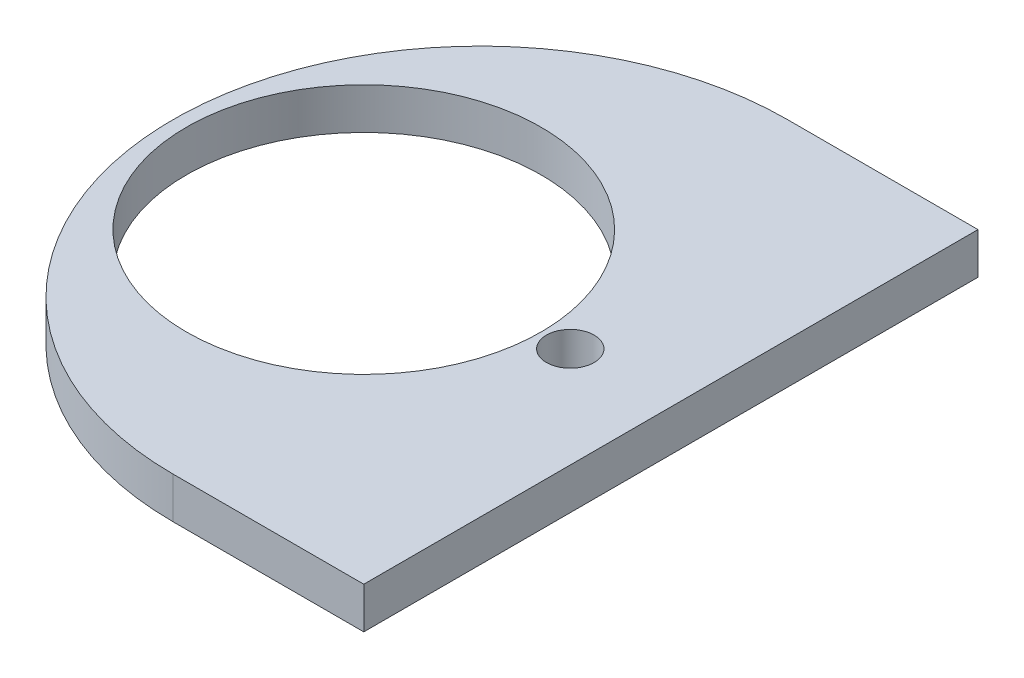
ISO-10303-21;
HEADER;
FILE_DESCRIPTION(('STEP AP214'),'2;1');
FILE_NAME('part.step','',(''),(''),'','','');
FILE_SCHEMA(('AUTOMOTIVE_DESIGN { 1 0 10303 214 1 1 1 1 }'));
ENDSEC;
DATA;
#1=APPLICATION_CONTEXT('core data for automotive mechanical design processes');
#2=APPLICATION_PROTOCOL_DEFINITION('international standard','automotive_design',2000,#1);
#3=PRODUCT_CONTEXT('',#1,'mechanical');
#4=PRODUCT('Part','Part','',(#3));
#5=PRODUCT_RELATED_PRODUCT_CATEGORY('part','',(#4));
#6=PRODUCT_DEFINITION_FORMATION('','',#4);
#7=PRODUCT_DEFINITION_CONTEXT('part definition',#1,'design');
#8=PRODUCT_DEFINITION('design','',#6,#7);
#9=PRODUCT_DEFINITION_SHAPE('','',#8);
#10=(LENGTH_UNIT() NAMED_UNIT(*) SI_UNIT(.MILLI.,.METRE.));
#11=(NAMED_UNIT(*) PLANE_ANGLE_UNIT() SI_UNIT($,.RADIAN.));
#12=(NAMED_UNIT(*) SI_UNIT($,.STERADIAN.) SOLID_ANGLE_UNIT());
#13=UNCERTAINTY_MEASURE_WITH_UNIT(LENGTH_MEASURE(1.E-05),#10,'distance_accuracy_value','');
#14=(GEOMETRIC_REPRESENTATION_CONTEXT(3) GLOBAL_UNCERTAINTY_ASSIGNED_CONTEXT((#13)) GLOBAL_UNIT_ASSIGNED_CONTEXT((#10,
#11,#12)) REPRESENTATION_CONTEXT('',''));
#15=CARTESIAN_POINT('',(0.,0.,0.));
#16=DIRECTION('',(0.,0.,1.));
#17=DIRECTION('',(1.,0.,0.));
#18=AXIS2_PLACEMENT_3D('',#15,#16,#17);
#19=CARTESIAN_POINT('',(0.,7.8,58.));
#20=DIRECTION('',(0.,1.,0.));
#21=DIRECTION('',(0.,0.,1.));
#22=AXIS2_PLACEMENT_3D('',#19,#20,#21);
#23=PLANE('',#22);
#24=CARTESIAN_POINT('',(-22.,7.8,58.));
#25=DIRECTION('',(0.,1.,0.));
#26=DIRECTION('',(0.,0.,1.));
#27=AXIS2_PLACEMENT_3D('',#24,#25,#26);
#28=CIRCLE('',#27,33.5);
#29=CARTESIAN_POINT('',(-22.,7.8,91.5));
#30=VERTEX_POINT('',#29);
#31=EDGE_CURVE('E118',#30,#30,#28,.T.);
#32=ORIENTED_EDGE('',*,*,#31,.F.);
#33=EDGE_LOOP('',(#32));
#34=FACE_BOUND('',#33,.T.);
#35=CARTESIAN_POINT('',(0.,7.8,58.));
#36=DIRECTION('',(0.,1.,0.));
#37=DIRECTION('',(0.,0.,1.));
#38=AXIS2_PLACEMENT_3D('',#35,#36,#37);
#39=CIRCLE('',#38,58.);
#40=CARTESIAN_POINT('',(0.,7.8,0.));
#41=VERTEX_POINT('',#40);
#42=CARTESIAN_POINT('',(0.,7.8,116.));
#43=VERTEX_POINT('',#42);
#44=EDGE_CURVE('E98',#41,#43,#39,.T.);
#45=ORIENTED_EDGE('',*,*,#44,.T.);
#46=DIRECTION('',(1.,0.,0.));
#47=VECTOR('',#46,1.);
#48=CARTESIAN_POINT('',(36.,7.8,116.));
#49=LINE('',#48,#47);
#50=CARTESIAN_POINT('',(36.,7.8,116.));
#51=VERTEX_POINT('',#50);
#52=EDGE_CURVE('E93',#43,#51,#49,.T.);
#53=ORIENTED_EDGE('',*,*,#52,.T.);
#54=DIRECTION('',(0.,0.,-1.));
#55=VECTOR('',#54,1.);
#56=CARTESIAN_POINT('',(36.,7.8,0.));
#57=LINE('',#56,#55);
#58=CARTESIAN_POINT('',(36.,7.8,0.));
#59=VERTEX_POINT('',#58);
#60=EDGE_CURVE('E96',#51,#59,#57,.T.);
#61=ORIENTED_EDGE('',*,*,#60,.T.);
#62=DIRECTION('',(-1.,0.,0.));
#63=VECTOR('',#62,1.);
#64=CARTESIAN_POINT('',(0.,7.8,0.));
#65=LINE('',#64,#63);
#66=EDGE_CURVE('E63',#59,#41,#65,.T.);
#67=ORIENTED_EDGE('',*,*,#66,.T.);
#68=EDGE_LOOP('',(#45,#53,#61,#67));
#69=FACE_BOUND('',#68,.T.);
#70=CARTESIAN_POINT('',(17.,7.8,58.));
#71=DIRECTION('',(0.,1.,0.));
#72=DIRECTION('',(0.,0.,1.));
#73=AXIS2_PLACEMENT_3D('',#70,#71,#72);
#74=CIRCLE('',#73,4.5);
#75=CARTESIAN_POINT('',(17.,7.8,62.5));
#76=VERTEX_POINT('',#75);
#77=EDGE_CURVE('E140',#76,#76,#74,.T.);
#78=ORIENTED_EDGE('',*,*,#77,.F.);
#79=EDGE_LOOP('',(#78));
#80=FACE_BOUND('',#79,.T.);
#81=ADVANCED_FACE('F45',(#34,#69,#80),#23,.T.);
#82=CARTESIAN_POINT('',(0.,0.,58.));
#83=DIRECTION('',(0.,1.,0.));
#84=DIRECTION('',(0.,0.,1.));
#85=AXIS2_PLACEMENT_3D('',#82,#83,#84);
#86=PLANE('',#85);
#87=CARTESIAN_POINT('',(0.,0.,58.));
#88=DIRECTION('',(0.,1.,0.));
#89=DIRECTION('',(0.,0.,1.));
#90=AXIS2_PLACEMENT_3D('',#87,#88,#89);
#91=CIRCLE('',#90,58.);
#92=CARTESIAN_POINT('',(0.,0.,0.));
#93=VERTEX_POINT('',#92);
#94=CARTESIAN_POINT('',(0.,0.,116.));
#95=VERTEX_POINT('',#94);
#96=EDGE_CURVE('E114',#93,#95,#91,.T.);
#97=ORIENTED_EDGE('',*,*,#96,.F.);
#98=DIRECTION('',(-1.,0.,0.));
#99=VECTOR('',#98,1.);
#100=CARTESIAN_POINT('',(0.,0.,0.));
#101=LINE('',#100,#99);
#102=CARTESIAN_POINT('',(36.,0.,0.));
#103=VERTEX_POINT('',#102);
#104=EDGE_CURVE('E86',#103,#93,#101,.T.);
#105=ORIENTED_EDGE('',*,*,#104,.F.);
#106=DIRECTION('',(0.,0.,-1.));
#107=VECTOR('',#106,1.);
#108=CARTESIAN_POINT('',(36.,0.,0.));
#109=LINE('',#108,#107);
#110=CARTESIAN_POINT('',(36.,0.,116.));
#111=VERTEX_POINT('',#110);
#112=EDGE_CURVE('E80',#111,#103,#109,.T.);
#113=ORIENTED_EDGE('',*,*,#112,.F.);
#114=DIRECTION('',(1.,0.,0.));
#115=VECTOR('',#114,1.);
#116=CARTESIAN_POINT('',(36.,0.,116.));
#117=LINE('',#116,#115);
#118=EDGE_CURVE('E103',#95,#111,#117,.T.);
#119=ORIENTED_EDGE('',*,*,#118,.F.);
#120=EDGE_LOOP('',(#97,#105,#113,#119));
#121=FACE_BOUND('',#120,.T.);
#122=CARTESIAN_POINT('',(-22.,0.,58.));
#123=DIRECTION('',(0.,1.,0.));
#124=DIRECTION('',(0.,0.,1.));
#125=AXIS2_PLACEMENT_3D('',#122,#123,#124);
#126=CIRCLE('',#125,33.5);
#127=CARTESIAN_POINT('',(-22.,0.,91.5));
#128=VERTEX_POINT('',#127);
#129=EDGE_CURVE('E136',#128,#128,#126,.T.);
#130=ORIENTED_EDGE('',*,*,#129,.T.);
#131=EDGE_LOOP('',(#130));
#132=FACE_BOUND('',#131,.T.);
#133=CARTESIAN_POINT('',(17.,0.,58.));
#134=DIRECTION('',(0.,1.,0.));
#135=DIRECTION('',(0.,0.,1.));
#136=AXIS2_PLACEMENT_3D('',#133,#134,#135);
#137=CIRCLE('',#136,4.5);
#138=CARTESIAN_POINT('',(17.,0.,62.5));
#139=VERTEX_POINT('',#138);
#140=EDGE_CURVE('E144',#139,#139,#137,.T.);
#141=ORIENTED_EDGE('',*,*,#140,.T.);
#142=EDGE_LOOP('',(#141));
#143=FACE_BOUND('',#142,.T.);
#144=ADVANCED_FACE('F131',(#121,#132,#143),#86,.F.);
#145=CARTESIAN_POINT('',(0.,7.8,58.));
#146=DIRECTION('',(0.,-1.,0.));
#147=DIRECTION('',(0.,0.,-1.));
#148=AXIS2_PLACEMENT_3D('',#145,#146,#147);
#149=CYLINDRICAL_SURFACE('',#148,58.);
#150=ORIENTED_EDGE('',*,*,#96,.T.);
#151=DIRECTION('',(0.,-1.,0.));
#152=VECTOR('',#151,1.);
#153=CARTESIAN_POINT('',(0.,7.8,116.));
#154=LINE('',#153,#152);
#155=EDGE_CURVE('E11',#43,#95,#154,.T.);
#156=ORIENTED_EDGE('',*,*,#155,.F.);
#157=ORIENTED_EDGE('',*,*,#44,.F.);
#158=DIRECTION('',(0.,-1.,0.));
#159=VECTOR('',#158,1.);
#160=CARTESIAN_POINT('',(0.,7.8,0.));
#161=LINE('',#160,#159);
#162=EDGE_CURVE('E110',#41,#93,#161,.T.);
#163=ORIENTED_EDGE('',*,*,#162,.T.);
#164=EDGE_LOOP('',(#150,#156,#157,#163));
#165=FACE_BOUND('',#164,.T.);
#166=ADVANCED_FACE('F47',(#165),#149,.T.);
#167=CARTESIAN_POINT('',(36.,7.8,116.));
#168=DIRECTION('',(0.,0.,-1.));
#169=DIRECTION('',(-1.,0.,0.));
#170=AXIS2_PLACEMENT_3D('',#167,#168,#169);
#171=PLANE('',#170);
#172=ORIENTED_EDGE('',*,*,#118,.T.);
#173=DIRECTION('',(0.,-1.,0.));
#174=VECTOR('',#173,1.);
#175=CARTESIAN_POINT('',(36.,7.8,116.));
#176=LINE('',#175,#174);
#177=EDGE_CURVE('E55',#51,#111,#176,.T.);
#178=ORIENTED_EDGE('',*,*,#177,.F.);
#179=ORIENTED_EDGE('',*,*,#52,.F.);
#180=ORIENTED_EDGE('',*,*,#155,.T.);
#181=EDGE_LOOP('',(#172,#178,#179,#180));
#182=FACE_BOUND('',#181,.T.);
#183=ADVANCED_FACE('F102',(#182),#171,.F.);
#184=CARTESIAN_POINT('',(36.,7.8,0.));
#185=DIRECTION('',(-1.,0.,0.));
#186=DIRECTION('',(0.,0.,1.));
#187=AXIS2_PLACEMENT_3D('',#184,#185,#186);
#188=PLANE('',#187);
#189=ORIENTED_EDGE('',*,*,#112,.T.);
#190=DIRECTION('',(0.,-1.,0.));
#191=VECTOR('',#190,1.);
#192=CARTESIAN_POINT('',(36.,7.8,0.));
#193=LINE('',#192,#191);
#194=EDGE_CURVE('E105',#59,#103,#193,.T.);
#195=ORIENTED_EDGE('',*,*,#194,.F.);
#196=ORIENTED_EDGE('',*,*,#60,.F.);
#197=ORIENTED_EDGE('',*,*,#177,.T.);
#198=EDGE_LOOP('',(#189,#195,#196,#197));
#199=FACE_BOUND('',#198,.T.);
#200=ADVANCED_FACE('F106',(#199),#188,.F.);
#201=CARTESIAN_POINT('',(0.,7.8,0.));
#202=DIRECTION('',(0.,0.,1.));
#203=DIRECTION('',(1.,0.,0.));
#204=AXIS2_PLACEMENT_3D('',#201,#202,#203);
#205=PLANE('',#204);
#206=ORIENTED_EDGE('',*,*,#104,.T.);
#207=ORIENTED_EDGE('',*,*,#162,.F.);
#208=ORIENTED_EDGE('',*,*,#66,.F.);
#209=ORIENTED_EDGE('',*,*,#194,.T.);
#210=EDGE_LOOP('',(#206,#207,#208,#209));
#211=FACE_BOUND('',#210,.T.);
#212=ADVANCED_FACE('F128',(#211),#205,.F.);
#213=CARTESIAN_POINT('',(-22.,7.8,58.));
#214=DIRECTION('',(0.,-1.,0.));
#215=DIRECTION('',(0.,0.,-1.));
#216=AXIS2_PLACEMENT_3D('',#213,#214,#215);
#217=CYLINDRICAL_SURFACE('',#216,33.5);
#218=ORIENTED_EDGE('',*,*,#31,.T.);
#219=EDGE_LOOP('',(#218));
#220=FACE_BOUND('',#219,.T.);
#221=ORIENTED_EDGE('',*,*,#129,.F.);
#222=EDGE_LOOP('',(#221));
#223=FACE_BOUND('',#222,.T.);
#224=ADVANCED_FACE('F163',(#220,#223),#217,.F.);
#225=CARTESIAN_POINT('',(17.,7.8,58.));
#226=DIRECTION('',(0.,-1.,0.));
#227=DIRECTION('',(0.,0.,-1.));
#228=AXIS2_PLACEMENT_3D('',#225,#226,#227);
#229=CYLINDRICAL_SURFACE('',#228,4.5);
#230=ORIENTED_EDGE('',*,*,#77,.T.);
#231=EDGE_LOOP('',(#230));
#232=FACE_BOUND('',#231,.T.);
#233=ORIENTED_EDGE('',*,*,#140,.F.);
#234=EDGE_LOOP('',(#233));
#235=FACE_BOUND('',#234,.T.);
#236=ADVANCED_FACE('F152',(#232,#235),#229,.F.);
#237=CLOSED_SHELL('',(#81,#144,#166,#183,#200,#212,#224,#236));
#238=MANIFOLD_SOLID_BREP('B2',#237);
#239=ADVANCED_BREP_SHAPE_REPRESENTATION('',(#18,#238),#14);
#240=SHAPE_DEFINITION_REPRESENTATION(#9,#239);
ENDSEC;
END-ISO-10303-21;
